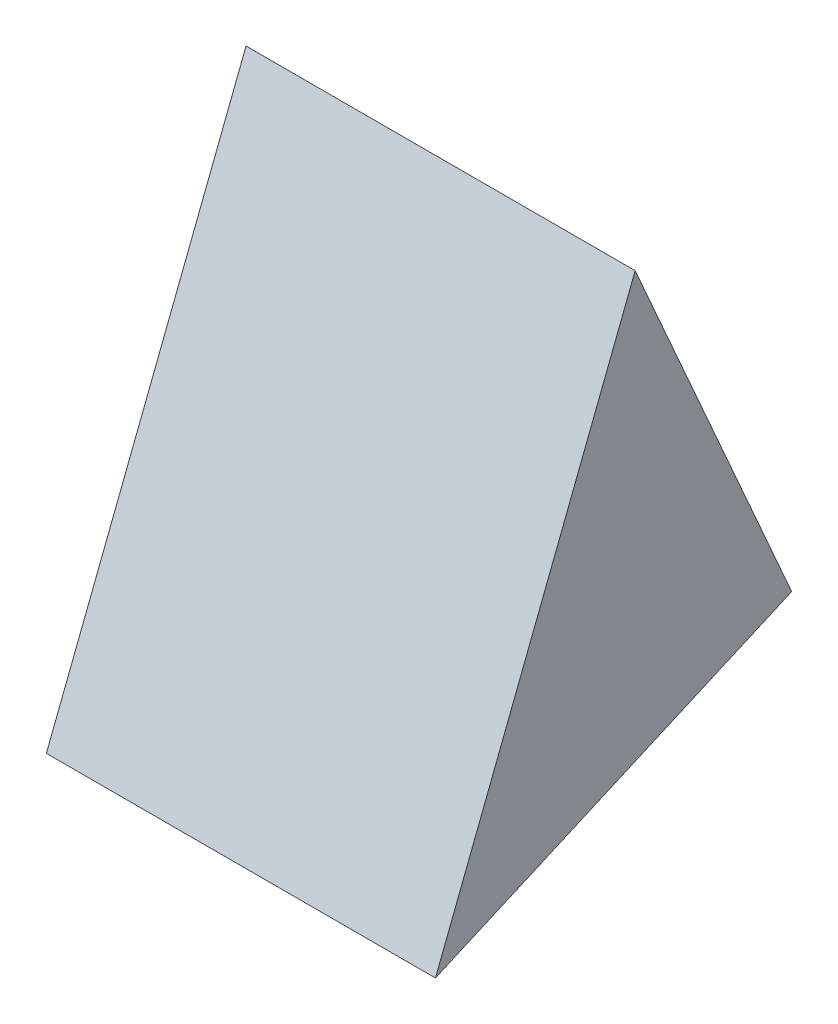
ISO-10303-21;
HEADER;
FILE_DESCRIPTION(('STEP AP214'),'2;1');
FILE_NAME('part.step','',(''),(''),'','','');
FILE_SCHEMA(('AUTOMOTIVE_DESIGN { 1 0 10303 214 1 1 1 1 }'));
ENDSEC;
DATA;
#1=APPLICATION_CONTEXT('core data for automotive mechanical design processes');
#2=APPLICATION_PROTOCOL_DEFINITION('international standard','automotive_design',2000,#1);
#3=PRODUCT_CONTEXT('',#1,'mechanical');
#4=PRODUCT('Part','Part','',(#3));
#5=PRODUCT_RELATED_PRODUCT_CATEGORY('part','',(#4));
#6=PRODUCT_DEFINITION_FORMATION('','',#4);
#7=PRODUCT_DEFINITION_CONTEXT('part definition',#1,'design');
#8=PRODUCT_DEFINITION('design','',#6,#7);
#9=PRODUCT_DEFINITION_SHAPE('','',#8);
#10=(LENGTH_UNIT() NAMED_UNIT(*) SI_UNIT(.MILLI.,.METRE.));
#11=(NAMED_UNIT(*) PLANE_ANGLE_UNIT() SI_UNIT($,.RADIAN.));
#12=(NAMED_UNIT(*) SI_UNIT($,.STERADIAN.) SOLID_ANGLE_UNIT());
#13=UNCERTAINTY_MEASURE_WITH_UNIT(LENGTH_MEASURE(1.E-05),#10,'distance_accuracy_value','');
#14=(GEOMETRIC_REPRESENTATION_CONTEXT(3) GLOBAL_UNCERTAINTY_ASSIGNED_CONTEXT((#13)) GLOBAL_UNIT_ASSIGNED_CONTEXT((#10,
#11,#12)) REPRESENTATION_CONTEXT('',''));
#15=CARTESIAN_POINT('',(0.,0.,0.));
#16=DIRECTION('',(0.,0.,1.));
#17=DIRECTION('',(1.,0.,0.));
#18=AXIS2_PLACEMENT_3D('',#15,#16,#17);
#19=CARTESIAN_POINT('',(30.,-10.6080987459047,5.10699388162417));
#20=DIRECTION('',(0.,-0.402259197285831,0.9155258260688));
#21=DIRECTION('',(0.,-0.9155258260688,-0.402259197285831));
#22=AXIS2_PLACEMENT_3D('',#19,#20,#21);
#23=PLANE('',#22);
#24=DIRECTION('',(0.,0.9155258260688,0.402259197285831));
#25=VECTOR('',#24,1.);
#26=CARTESIAN_POINT('',(0.,-10.6080987459047,5.10699388162417));
#27=LINE('',#26,#25);
#28=CARTESIAN_POINT('',(0.,-10.6080987459047,5.10699388162417));
#29=VERTEX_POINT('',#28);
#30=CARTESIAN_POINT('',(0.,16.8576760361593,17.1747698001991));
#31=VERTEX_POINT('',#30);
#32=EDGE_CURVE('E82',#29,#31,#27,.T.);
#33=ORIENTED_EDGE('',*,*,#32,.T.);
#34=DIRECTION('',(-1.,0.,0.));
#35=VECTOR('',#34,1.);
#36=CARTESIAN_POINT('',(30.,16.8576760361593,17.1747698001991));
#37=LINE('',#36,#35);
#38=CARTESIAN_POINT('',(30.,16.8576760361593,17.1747698001991));
#39=VERTEX_POINT('',#38);
#40=EDGE_CURVE('E11',#39,#31,#37,.T.);
#41=ORIENTED_EDGE('',*,*,#40,.F.);
#42=DIRECTION('',(0.,0.9155258260688,0.402259197285831));
#43=VECTOR('',#42,1.);
#44=CARTESIAN_POINT('',(30.,-10.6080987459047,5.10699388162417));
#45=LINE('',#44,#43);
#46=CARTESIAN_POINT('',(30.,-10.6080987459047,5.10699388162417));
#47=VERTEX_POINT('',#46);
#48=EDGE_CURVE('E75',#47,#39,#45,.T.);
#49=ORIENTED_EDGE('',*,*,#48,.F.);
#50=DIRECTION('',(-1.,0.,0.));
#51=VECTOR('',#50,1.);
#52=CARTESIAN_POINT('',(30.,-10.6080987459047,5.10699388162417));
#53=LINE('',#52,#51);
#54=EDGE_CURVE('E83',#47,#29,#53,.T.);
#55=ORIENTED_EDGE('',*,*,#54,.T.);
#56=EDGE_LOOP('',(#33,#41,#49,#55));
#57=FACE_BOUND('',#56,.T.);
#58=ADVANCED_FACE('F35',(#57),#23,.F.);
#59=CARTESIAN_POINT('',(30.,16.8576760361593,17.1747698001991));
#60=DIRECTION('',(0.,-0.362934313769193,-0.931814726160134));
#61=DIRECTION('',(0.,0.931814726160134,-0.362934313769193));
#62=AXIS2_PLACEMENT_3D('',#59,#60,#61);
#63=PLANE('',#62);
#64=DIRECTION('',(0.,-0.931814726160134,0.362934313769193));
#65=VECTOR('',#64,1.);
#66=CARTESIAN_POINT('',(0.,16.8576760361593,17.1747698001991));
#67=LINE('',#66,#65);
#68=CARTESIAN_POINT('',(0.,-22.6758746644795,32.572768663688));
#69=VERTEX_POINT('',#68);
#70=EDGE_CURVE('E63',#31,#69,#67,.T.);
#71=ORIENTED_EDGE('',*,*,#70,.T.);
#72=DIRECTION('',(-1.,0.,0.));
#73=VECTOR('',#72,1.);
#74=CARTESIAN_POINT('',(30.,-22.6758746644795,32.572768663688));
#75=LINE('',#74,#73);
#76=CARTESIAN_POINT('',(30.,-22.6758746644795,32.572768663688));
#77=VERTEX_POINT('',#76);
#78=EDGE_CURVE('E43',#77,#69,#75,.T.);
#79=ORIENTED_EDGE('',*,*,#78,.F.);
#80=DIRECTION('',(0.,-0.931814726160134,0.362934313769193));
#81=VECTOR('',#80,1.);
#82=CARTESIAN_POINT('',(30.,16.8576760361593,17.1747698001991));
#83=LINE('',#82,#81);
#84=EDGE_CURVE('E71',#39,#77,#83,.T.);
#85=ORIENTED_EDGE('',*,*,#84,.F.);
#86=ORIENTED_EDGE('',*,*,#40,.T.);
#87=EDGE_LOOP('',(#71,#79,#85,#86));
#88=FACE_BOUND('',#87,.T.);
#89=ADVANCED_FACE('F72',(#88),#63,.F.);
#90=CARTESIAN_POINT('',(30.,-22.6758746644795,32.572768663688));
#91=DIRECTION('',(0.,0.9155258260688,0.402259197285831));
#92=DIRECTION('',(0.,-0.402259197285831,0.9155258260688));
#93=AXIS2_PLACEMENT_3D('',#90,#91,#92);
#94=PLANE('',#93);
#95=DIRECTION('',(0.,0.402259197285831,-0.9155258260688));
#96=VECTOR('',#95,1.);
#97=CARTESIAN_POINT('',(0.,-22.6758746644795,32.572768663688));
#98=LINE('',#97,#96);
#99=EDGE_CURVE('E68',#69,#29,#98,.T.);
#100=ORIENTED_EDGE('',*,*,#99,.T.);
#101=ORIENTED_EDGE('',*,*,#54,.F.);
#102=DIRECTION('',(0.,0.402259197285831,-0.9155258260688));
#103=VECTOR('',#102,1.);
#104=CARTESIAN_POINT('',(30.,-22.6758746644795,32.572768663688));
#105=LINE('',#104,#103);
#106=EDGE_CURVE('E51',#77,#47,#105,.T.);
#107=ORIENTED_EDGE('',*,*,#106,.F.);
#108=ORIENTED_EDGE('',*,*,#78,.T.);
#109=EDGE_LOOP('',(#100,#101,#107,#108));
#110=FACE_BOUND('',#109,.T.);
#111=ADVANCED_FACE('F90',(#110),#94,.F.);
#112=CARTESIAN_POINT('',(30.,0.,0.));
#113=DIRECTION('',(-1.,0.,0.));
#114=DIRECTION('',(0.,0.,1.));
#115=AXIS2_PLACEMENT_3D('',#112,#113,#114);
#116=PLANE('',#115);
#117=ORIENTED_EDGE('',*,*,#48,.T.);
#118=ORIENTED_EDGE('',*,*,#84,.T.);
#119=ORIENTED_EDGE('',*,*,#106,.T.);
#120=EDGE_LOOP('',(#117,#118,#119));
#121=FACE_BOUND('',#120,.T.);
#122=ADVANCED_FACE('F78',(#121),#116,.F.);
#123=CARTESIAN_POINT('',(0.,0.,0.));
#124=DIRECTION('',(-1.,0.,0.));
#125=DIRECTION('',(0.,0.,1.));
#126=AXIS2_PLACEMENT_3D('',#123,#124,#125);
#127=PLANE('',#126);
#128=ORIENTED_EDGE('',*,*,#32,.F.);
#129=ORIENTED_EDGE('',*,*,#99,.F.);
#130=ORIENTED_EDGE('',*,*,#70,.F.);
#131=EDGE_LOOP('',(#128,#129,#130));
#132=FACE_BOUND('',#131,.T.);
#133=ADVANCED_FACE('F91',(#132),#127,.T.);
#134=CLOSED_SHELL('',(#58,#89,#111,#122,#133));
#135=MANIFOLD_SOLID_BREP('B2',#134);
#136=ADVANCED_BREP_SHAPE_REPRESENTATION('',(#18,#135),#14);
#137=SHAPE_DEFINITION_REPRESENTATION(#9,#136);
ENDSEC;
END-ISO-10303-21;
